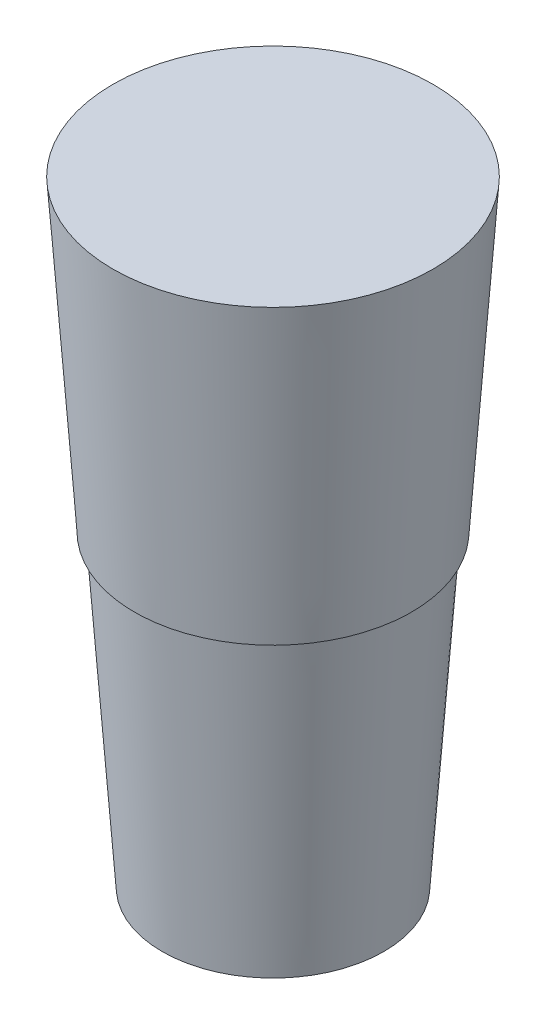
ISO-10303-21;
HEADER;
FILE_DESCRIPTION(('STEP AP214'),'2;1');
FILE_NAME('part.step','',(''),(''),'','','');
FILE_SCHEMA(('AUTOMOTIVE_DESIGN { 1 0 10303 214 1 1 1 1 }'));
ENDSEC;
DATA;
#1=APPLICATION_CONTEXT('core data for automotive mechanical design processes');
#2=APPLICATION_PROTOCOL_DEFINITION('international standard','automotive_design',2000,#1);
#3=PRODUCT_CONTEXT('',#1,'mechanical');
#4=PRODUCT('Part','Part','',(#3));
#5=PRODUCT_RELATED_PRODUCT_CATEGORY('part','',(#4));
#6=PRODUCT_DEFINITION_FORMATION('','',#4);
#7=PRODUCT_DEFINITION_CONTEXT('part definition',#1,'design');
#8=PRODUCT_DEFINITION('design','',#6,#7);
#9=PRODUCT_DEFINITION_SHAPE('','',#8);
#10=(LENGTH_UNIT() NAMED_UNIT(*) SI_UNIT(.MILLI.,.METRE.));
#11=(NAMED_UNIT(*) PLANE_ANGLE_UNIT() SI_UNIT($,.RADIAN.));
#12=(NAMED_UNIT(*) SI_UNIT($,.STERADIAN.) SOLID_ANGLE_UNIT());
#13=UNCERTAINTY_MEASURE_WITH_UNIT(LENGTH_MEASURE(1.E-05),#10,'distance_accuracy_value','');
#14=(GEOMETRIC_REPRESENTATION_CONTEXT(3) GLOBAL_UNCERTAINTY_ASSIGNED_CONTEXT((#13)) GLOBAL_UNIT_ASSIGNED_CONTEXT((#10,
#11,#12)) REPRESENTATION_CONTEXT('',''));
#15=CARTESIAN_POINT('',(0.,0.,0.));
#16=DIRECTION('',(0.,0.,1.));
#17=DIRECTION('',(1.,0.,0.));
#18=AXIS2_PLACEMENT_3D('',#15,#16,#17);
#19=CARTESIAN_POINT('',(42.0304501724065,-40.6154473473444,0.));
#20=DIRECTION('',(0.,-1.,0.));
#21=DIRECTION('',(0.,0.,-1.));
#22=AXIS2_PLACEMENT_3D('',#19,#20,#21);
#23=PLANE('',#22);
#24=CARTESIAN_POINT('',(42.0304501724065,-40.6154473473444,0.));
#25=DIRECTION('',(0.,-1.,0.));
#26=DIRECTION('',(0.,0.,-1.));
#27=AXIS2_PLACEMENT_3D('',#24,#25,#26);
#28=CIRCLE('',#27,22.86);
#29=CARTESIAN_POINT('',(42.0304501724065,-40.6154473473444,-22.86));
#30=VERTEX_POINT('',#29);
#31=EDGE_CURVE('E10',#30,#30,#28,.T.);
#32=ORIENTED_EDGE('',*,*,#31,.T.);
#33=EDGE_LOOP('',(#32));
#34=FACE_BOUND('',#33,.T.);
#35=ADVANCED_FACE('F37',(#34),#23,.T.);
#36=CARTESIAN_POINT('',(42.0304501724065,-40.6154473473444,0.));
#37=DIRECTION('',(0.,1.,0.));
#38=DIRECTION('',(0.,0.,1.));
#39=AXIS2_PLACEMENT_3D('',#36,#37,#38);
#40=CONICAL_SURFACE('',#39,22.86,0.06988603083126);
#41=CARTESIAN_POINT('',(42.0304501724065,22.8845526526556,0.));
#42=DIRECTION('',(0.,-1.,0.));
#43=DIRECTION('',(0.,0.,-1.));
#44=AXIS2_PLACEMENT_3D('',#41,#42,#43);
#45=CIRCLE('',#44,27.3050018630697);
#46=CARTESIAN_POINT('',(42.0304501724065,22.8845526526556,-27.3050018630697));
#47=VERTEX_POINT('',#46);
#48=EDGE_CURVE('E44',#47,#47,#45,.T.);
#49=ORIENTED_EDGE('',*,*,#48,.T.);
#50=EDGE_LOOP('',(#49));
#51=FACE_BOUND('',#50,.T.);
#52=ORIENTED_EDGE('',*,*,#31,.F.);
#53=EDGE_LOOP('',(#52));
#54=FACE_BOUND('',#53,.T.);
#55=ADVANCED_FACE('F73',(#51,#54),#40,.T.);
#56=CARTESIAN_POINT('',(69.3354520354763,22.8845526526556,0.));
#57=DIRECTION('',(0.,-1.,0.));
#58=DIRECTION('',(0.,0.,-1.));
#59=AXIS2_PLACEMENT_3D('',#56,#57,#58);
#60=PLANE('',#59);
#61=CARTESIAN_POINT('',(42.0304501724065,22.8845526526556,0.));
#62=DIRECTION('',(0.,-1.,0.));
#63=DIRECTION('',(0.,0.,-1.));
#64=AXIS2_PLACEMENT_3D('',#61,#62,#63);
#65=CIRCLE('',#64,28.5749981369303);
#66=CARTESIAN_POINT('',(42.0304501724065,22.8845526526556,-28.5749981369303));
#67=VERTEX_POINT('',#66);
#68=EDGE_CURVE('E49',#67,#67,#65,.T.);
#69=ORIENTED_EDGE('',*,*,#68,.T.);
#70=EDGE_LOOP('',(#69));
#71=FACE_BOUND('',#70,.T.);
#72=ORIENTED_EDGE('',*,*,#48,.F.);
#73=EDGE_LOOP('',(#72));
#74=FACE_BOUND('',#73,.T.);
#75=ADVANCED_FACE('F70',(#71,#74),#60,.T.);
#76=CARTESIAN_POINT('',(42.0304501724065,22.8845526526556,0.));
#77=DIRECTION('',(0.,1.,0.));
#78=DIRECTION('',(0.,0.,1.));
#79=AXIS2_PLACEMENT_3D('',#76,#77,#78);
#80=CONICAL_SURFACE('',#79,28.5749981369303,0.06988603083126);
#81=CARTESIAN_POINT('',(42.0304501724065,86.3845526526556,0.));
#82=DIRECTION('',(0.,-1.,0.));
#83=DIRECTION('',(0.,0.,-1.));
#84=AXIS2_PLACEMENT_3D('',#81,#82,#83);
#85=CIRCLE('',#84,33.02);
#86=CARTESIAN_POINT('',(42.0304501724065,86.3845526526556,-33.02));
#87=VERTEX_POINT('',#86);
#88=EDGE_CURVE('E54',#87,#87,#85,.T.);
#89=ORIENTED_EDGE('',*,*,#88,.T.);
#90=EDGE_LOOP('',(#89));
#91=FACE_BOUND('',#90,.T.);
#92=ORIENTED_EDGE('',*,*,#68,.F.);
#93=EDGE_LOOP('',(#92));
#94=FACE_BOUND('',#93,.T.);
#95=ADVANCED_FACE('F61',(#91,#94),#80,.T.);
#96=CARTESIAN_POINT('',(75.0504501724065,86.3845526526556,0.));
#97=DIRECTION('',(0.,1.,0.));
#98=DIRECTION('',(0.,0.,1.));
#99=AXIS2_PLACEMENT_3D('',#96,#97,#98);
#100=PLANE('',#99);
#101=ORIENTED_EDGE('',*,*,#88,.F.);
#102=EDGE_LOOP('',(#101));
#103=FACE_BOUND('',#102,.T.);
#104=ADVANCED_FACE('F64',(#103),#100,.T.);
#105=CLOSED_SHELL('',(#35,#55,#75,#95,#104));
#106=MANIFOLD_SOLID_BREP('B2',#105);
#107=ADVANCED_BREP_SHAPE_REPRESENTATION('',(#18,#106),#14);
#108=SHAPE_DEFINITION_REPRESENTATION(#9,#107);
ENDSEC;
END-ISO-10303-21;
